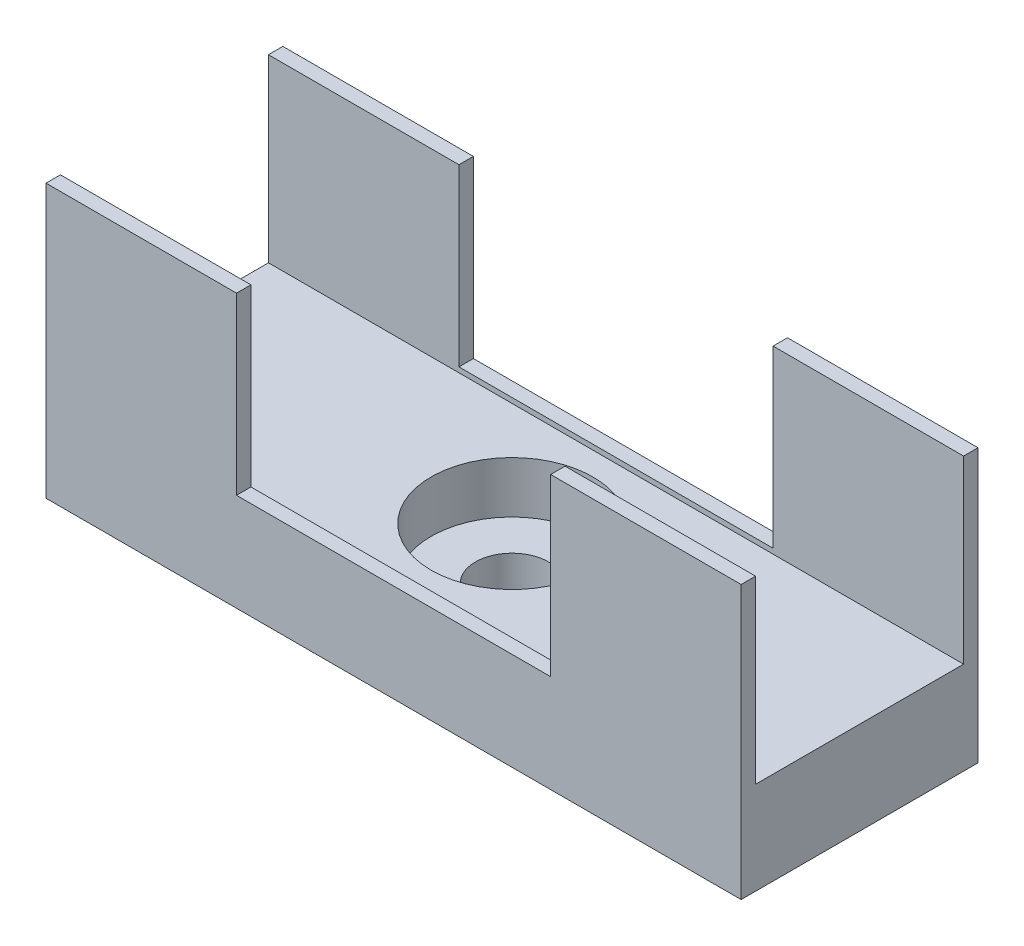
ISO-10303-21;
HEADER;
FILE_DESCRIPTION(('STEP AP214'),'2;1');
FILE_NAME('part.step','',(''),(''),'','','');
FILE_SCHEMA(('AUTOMOTIVE_DESIGN { 1 0 10303 214 1 1 1 1 }'));
ENDSEC;
DATA;
#1=APPLICATION_CONTEXT('core data for automotive mechanical design processes');
#2=APPLICATION_PROTOCOL_DEFINITION('international standard','automotive_design',2000,#1);
#3=PRODUCT_CONTEXT('',#1,'mechanical');
#4=PRODUCT('Part','Part','',(#3));
#5=PRODUCT_RELATED_PRODUCT_CATEGORY('part','',(#4));
#6=PRODUCT_DEFINITION_FORMATION('','',#4);
#7=PRODUCT_DEFINITION_CONTEXT('part definition',#1,'design');
#8=PRODUCT_DEFINITION('design','',#6,#7);
#9=PRODUCT_DEFINITION_SHAPE('','',#8);
#10=(LENGTH_UNIT() NAMED_UNIT(*) SI_UNIT(.MILLI.,.METRE.));
#11=(NAMED_UNIT(*) PLANE_ANGLE_UNIT() SI_UNIT($,.RADIAN.));
#12=(NAMED_UNIT(*) SI_UNIT($,.STERADIAN.) SOLID_ANGLE_UNIT());
#13=UNCERTAINTY_MEASURE_WITH_UNIT(LENGTH_MEASURE(1.E-05),#10,'distance_accuracy_value','');
#14=(GEOMETRIC_REPRESENTATION_CONTEXT(3) GLOBAL_UNCERTAINTY_ASSIGNED_CONTEXT((#13)) GLOBAL_UNIT_ASSIGNED_CONTEXT((#10,
#11,#12)) REPRESENTATION_CONTEXT('',''));
#15=CARTESIAN_POINT('',(0.,0.,0.));
#16=DIRECTION('',(0.,0.,1.));
#17=DIRECTION('',(1.,0.,0.));
#18=AXIS2_PLACEMENT_3D('',#15,#16,#17);
#19=CARTESIAN_POINT('',(0.,13.462,0.));
#20=DIRECTION('',(0.,1.,0.));
#21=DIRECTION('',(0.,0.,1.));
#22=AXIS2_PLACEMENT_3D('',#19,#20,#21);
#23=PLANE('',#22);
#24=DIRECTION('',(1.,0.,0.));
#25=VECTOR('',#24,1.);
#26=CARTESIAN_POINT('',(-17.145,13.462,5.1308));
#27=LINE('',#26,#25);
#28=CARTESIAN_POINT('',(-17.145,13.462,5.1308));
#29=VERTEX_POINT('',#28);
#30=CARTESIAN_POINT('',(-7.747,13.462,5.1308));
#31=VERTEX_POINT('',#30);
#32=EDGE_CURVE('E164',#29,#31,#27,.T.);
#33=ORIENTED_EDGE('',*,*,#32,.F.);
#34=DIRECTION('',(0.,0.,1.));
#35=VECTOR('',#34,1.);
#36=CARTESIAN_POINT('',(-17.145,13.462,-5.842));
#37=LINE('',#36,#35);
#38=CARTESIAN_POINT('',(-17.145,13.462,5.842));
#39=VERTEX_POINT('',#38);
#40=EDGE_CURVE('E220',#29,#39,#37,.T.);
#41=ORIENTED_EDGE('',*,*,#40,.T.);
#42=DIRECTION('',(1.,0.,0.));
#43=VECTOR('',#42,1.);
#44=CARTESIAN_POINT('',(-17.145,13.462,5.842));
#45=LINE('',#44,#43);
#46=CARTESIAN_POINT('',(-7.747,13.462,5.842));
#47=VERTEX_POINT('',#46);
#48=EDGE_CURVE('E225',#39,#47,#45,.T.);
#49=ORIENTED_EDGE('',*,*,#48,.T.);
#50=DIRECTION('',(0.,0.,1.));
#51=VECTOR('',#50,1.);
#52=CARTESIAN_POINT('',(-7.747,13.462,0.));
#53=LINE('',#52,#51);
#54=EDGE_CURVE('E251',#31,#47,#53,.T.);
#55=ORIENTED_EDGE('',*,*,#54,.F.);
#56=EDGE_LOOP('',(#33,#41,#49,#55));
#57=FACE_BOUND('',#56,.T.);
#58=ADVANCED_FACE('F33',(#57),#23,.T.);
#59=CARTESIAN_POINT('',(7.747,13.462,5.1308));
#60=VERTEX_POINT('',#59);
#61=CARTESIAN_POINT('',(17.145,13.462,5.1308));
#62=VERTEX_POINT('',#61);
#63=EDGE_CURVE('E289',#60,#62,#27,.T.);
#64=ORIENTED_EDGE('',*,*,#63,.F.);
#65=DIRECTION('',(0.,0.,-1.));
#66=VECTOR('',#65,1.);
#67=CARTESIAN_POINT('',(7.747,13.462,0.));
#68=LINE('',#67,#66);
#69=CARTESIAN_POINT('',(7.747,13.462,5.842));
#70=VERTEX_POINT('',#69);
#71=EDGE_CURVE('E249',#70,#60,#68,.T.);
#72=ORIENTED_EDGE('',*,*,#71,.F.);
#73=CARTESIAN_POINT('',(17.145,13.462,5.842));
#74=VERTEX_POINT('',#73);
#75=EDGE_CURVE('E224',#70,#74,#45,.T.);
#76=ORIENTED_EDGE('',*,*,#75,.T.);
#77=DIRECTION('',(0.,0.,-1.));
#78=VECTOR('',#77,1.);
#79=CARTESIAN_POINT('',(17.145,13.462,-5.842));
#80=LINE('',#79,#78);
#81=EDGE_CURVE('E213',#74,#62,#80,.T.);
#82=ORIENTED_EDGE('',*,*,#81,.T.);
#83=EDGE_LOOP('',(#64,#72,#76,#82));
#84=FACE_BOUND('',#83,.T.);
#85=ADVANCED_FACE('F316',(#84),#23,.T.);
#86=CARTESIAN_POINT('',(-7.747,4.826,-17.78));
#87=DIRECTION('',(0.,-1.,0.));
#88=DIRECTION('',(1.,0.,0.));
#89=AXIS2_PLACEMENT_3D('',#86,#87,#88);
#90=PLANE('',#89);
#91=DIRECTION('',(0.,0.,1.));
#92=VECTOR('',#91,1.);
#93=CARTESIAN_POINT('',(7.747,4.826,-17.78));
#94=LINE('',#93,#92);
#95=CARTESIAN_POINT('',(7.747,4.826,5.1308));
#96=VERTEX_POINT('',#95);
#97=CARTESIAN_POINT('',(7.747,4.826,5.842));
#98=VERTEX_POINT('',#97);
#99=EDGE_CURVE('E200',#96,#98,#94,.T.);
#100=ORIENTED_EDGE('',*,*,#99,.F.);
#101=DIRECTION('',(-1.,0.,0.));
#102=VECTOR('',#101,1.);
#103=CARTESIAN_POINT('',(-7.747,4.826,5.1308));
#104=LINE('',#103,#102);
#105=CARTESIAN_POINT('',(-7.747,4.826,5.1308));
#106=VERTEX_POINT('',#105);
#107=EDGE_CURVE('E182',#96,#106,#104,.T.);
#108=ORIENTED_EDGE('',*,*,#107,.T.);
#109=DIRECTION('',(0.,0.,1.));
#110=VECTOR('',#109,1.);
#111=CARTESIAN_POINT('',(-7.747,4.826,-17.78));
#112=LINE('',#111,#110);
#113=CARTESIAN_POINT('',(-7.747,4.826,5.842));
#114=VERTEX_POINT('',#113);
#115=EDGE_CURVE('E195',#106,#114,#112,.T.);
#116=ORIENTED_EDGE('',*,*,#115,.T.);
#117=DIRECTION('',(1.,0.,0.));
#118=VECTOR('',#117,1.);
#119=CARTESIAN_POINT('',(-7.747,4.826,5.842));
#120=LINE('',#119,#118);
#121=EDGE_CURVE('E191',#114,#98,#120,.T.);
#122=ORIENTED_EDGE('',*,*,#121,.T.);
#123=EDGE_LOOP('',(#100,#108,#116,#122));
#124=FACE_BOUND('',#123,.T.);
#125=ADVANCED_FACE('F312',(#124),#90,.F.);
#126=CARTESIAN_POINT('',(-7.747,13.462,-17.78));
#127=DIRECTION('',(-1.,0.,0.));
#128=DIRECTION('',(0.,-1.,0.));
#129=AXIS2_PLACEMENT_3D('',#126,#127,#128);
#130=PLANE('',#129);
#131=ORIENTED_EDGE('',*,*,#115,.F.);
#132=DIRECTION('',(0.,1.,0.));
#133=VECTOR('',#132,1.);
#134=CARTESIAN_POINT('',(-7.747,13.462,5.1308));
#135=LINE('',#134,#133);
#136=EDGE_CURVE('E185',#106,#31,#135,.T.);
#137=ORIENTED_EDGE('',*,*,#136,.T.);
#138=ORIENTED_EDGE('',*,*,#54,.T.);
#139=DIRECTION('',(0.,-1.,0.));
#140=VECTOR('',#139,1.);
#141=CARTESIAN_POINT('',(-7.747,13.462,5.842));
#142=LINE('',#141,#140);
#143=EDGE_CURVE('E188',#47,#114,#142,.T.);
#144=ORIENTED_EDGE('',*,*,#143,.T.);
#145=EDGE_LOOP('',(#131,#137,#138,#144));
#146=FACE_BOUND('',#145,.T.);
#147=ADVANCED_FACE('F309',(#146),#130,.F.);
#148=CARTESIAN_POINT('',(7.747,13.462,-17.78));
#149=DIRECTION('',(1.,0.,0.));
#150=DIRECTION('',(0.,1.,0.));
#151=AXIS2_PLACEMENT_3D('',#148,#149,#150);
#152=PLANE('',#151);
#153=ORIENTED_EDGE('',*,*,#71,.T.);
#154=DIRECTION('',(0.,-1.,0.));
#155=VECTOR('',#154,1.);
#156=CARTESIAN_POINT('',(7.747,13.462,5.1308));
#157=LINE('',#156,#155);
#158=EDGE_CURVE('E11',#60,#96,#157,.T.);
#159=ORIENTED_EDGE('',*,*,#158,.T.);
#160=ORIENTED_EDGE('',*,*,#99,.T.);
#161=DIRECTION('',(0.,1.,0.));
#162=VECTOR('',#161,1.);
#163=CARTESIAN_POINT('',(7.747,13.462,5.842));
#164=LINE('',#163,#162);
#165=EDGE_CURVE('E56',#98,#70,#164,.T.);
#166=ORIENTED_EDGE('',*,*,#165,.T.);
#167=EDGE_LOOP('',(#153,#159,#160,#166));
#168=FACE_BOUND('',#167,.T.);
#169=ADVANCED_FACE('F313',(#168),#152,.F.);
#170=DIRECTION('',(-1.,0.,0.));
#171=VECTOR('',#170,1.);
#172=CARTESIAN_POINT('',(-17.145,13.462,-5.1308));
#173=LINE('',#172,#171);
#174=CARTESIAN_POINT('',(-7.747,13.462,-5.1308));
#175=VERTEX_POINT('',#174);
#176=CARTESIAN_POINT('',(-17.145,13.462,-5.1308));
#177=VERTEX_POINT('',#176);
#178=EDGE_CURVE('E281',#175,#177,#173,.T.);
#179=ORIENTED_EDGE('',*,*,#178,.F.);
#180=CARTESIAN_POINT('',(-7.747,13.462,-5.842));
#181=VERTEX_POINT('',#180);
#182=EDGE_CURVE('E252',#181,#175,#53,.T.);
#183=ORIENTED_EDGE('',*,*,#182,.F.);
#184=DIRECTION('',(-1.,0.,0.));
#185=VECTOR('',#184,1.);
#186=CARTESIAN_POINT('',(-17.145,13.462,-5.842));
#187=LINE('',#186,#185);
#188=CARTESIAN_POINT('',(-17.145,13.462,-5.842));
#189=VERTEX_POINT('',#188);
#190=EDGE_CURVE('E216',#181,#189,#187,.T.);
#191=ORIENTED_EDGE('',*,*,#190,.T.);
#192=EDGE_CURVE('E221',#189,#177,#37,.T.);
#193=ORIENTED_EDGE('',*,*,#192,.T.);
#194=EDGE_LOOP('',(#179,#183,#191,#193));
#195=FACE_BOUND('',#194,.T.);
#196=ADVANCED_FACE('F279',(#195),#23,.T.);
#197=CARTESIAN_POINT('',(17.145,13.462,-5.842));
#198=DIRECTION('',(-1.,0.,0.));
#199=DIRECTION('',(0.,0.,1.));
#200=AXIS2_PLACEMENT_3D('',#197,#198,#199);
#201=PLANE('',#200);
#202=DIRECTION('',(0.,0.,-1.));
#203=VECTOR('',#202,1.);
#204=CARTESIAN_POINT('',(17.145,4.572,-5.1308));
#205=LINE('',#204,#203);
#206=CARTESIAN_POINT('',(17.145,4.572,5.1308));
#207=VERTEX_POINT('',#206);
#208=CARTESIAN_POINT('',(17.145,4.572,-5.1308));
#209=VERTEX_POINT('',#208);
#210=EDGE_CURVE('E155',#207,#209,#205,.T.);
#211=ORIENTED_EDGE('',*,*,#210,.F.);
#212=DIRECTION('',(0.,1.,0.));
#213=VECTOR('',#212,1.);
#214=CARTESIAN_POINT('',(17.145,4.572,5.1308));
#215=LINE('',#214,#213);
#216=EDGE_CURVE('E179',#207,#62,#215,.T.);
#217=ORIENTED_EDGE('',*,*,#216,.T.);
#218=ORIENTED_EDGE('',*,*,#81,.F.);
#219=DIRECTION('',(0.,-1.,0.));
#220=VECTOR('',#219,1.);
#221=CARTESIAN_POINT('',(17.145,13.462,5.842));
#222=LINE('',#221,#220);
#223=CARTESIAN_POINT('',(17.145,0.,5.842));
#224=VERTEX_POINT('',#223);
#225=EDGE_CURVE('E228',#74,#224,#222,.T.);
#226=ORIENTED_EDGE('',*,*,#225,.T.);
#227=DIRECTION('',(0.,0.,-1.));
#228=VECTOR('',#227,1.);
#229=CARTESIAN_POINT('',(17.145,0.,-5.842));
#230=LINE('',#229,#228);
#231=CARTESIAN_POINT('',(17.145,0.,-5.842));
#232=VERTEX_POINT('',#231);
#233=EDGE_CURVE('E212',#224,#232,#230,.T.);
#234=ORIENTED_EDGE('',*,*,#233,.T.);
#235=DIRECTION('',(0.,-1.,0.));
#236=VECTOR('',#235,1.);
#237=CARTESIAN_POINT('',(17.145,13.462,-5.842));
#238=LINE('',#237,#236);
#239=CARTESIAN_POINT('',(17.145,13.462,-5.842));
#240=VERTEX_POINT('',#239);
#241=EDGE_CURVE('E245',#240,#232,#238,.T.);
#242=ORIENTED_EDGE('',*,*,#241,.F.);
#243=CARTESIAN_POINT('',(17.145,13.462,-5.1308));
#244=VERTEX_POINT('',#243);
#245=EDGE_CURVE('E168',#244,#240,#80,.T.);
#246=ORIENTED_EDGE('',*,*,#245,.F.);
#247=DIRECTION('',(0.,1.,0.));
#248=VECTOR('',#247,1.);
#249=CARTESIAN_POINT('',(17.145,4.572,-5.1308));
#250=LINE('',#249,#248);
#251=EDGE_CURVE('E149',#209,#244,#250,.T.);
#252=ORIENTED_EDGE('',*,*,#251,.F.);
#253=EDGE_LOOP('',(#211,#217,#218,#226,#234,#242,#246,#252));
#254=FACE_BOUND('',#253,.T.);
#255=ADVANCED_FACE('F35',(#254),#201,.F.);
#256=CARTESIAN_POINT('',(-17.145,13.462,-5.842));
#257=DIRECTION('',(0.,0.,1.));
#258=DIRECTION('',(1.,0.,0.));
#259=AXIS2_PLACEMENT_3D('',#256,#257,#258);
#260=PLANE('',#259);
#261=ORIENTED_EDGE('',*,*,#190,.F.);
#262=DIRECTION('',(0.,-1.,0.));
#263=VECTOR('',#262,1.);
#264=CARTESIAN_POINT('',(-7.747,13.462,-5.842));
#265=LINE('',#264,#263);
#266=CARTESIAN_POINT('',(-7.747,4.826,-5.842));
#267=VERTEX_POINT('',#266);
#268=EDGE_CURVE('E206',#181,#267,#265,.T.);
#269=ORIENTED_EDGE('',*,*,#268,.T.);
#270=DIRECTION('',(1.,0.,0.));
#271=VECTOR('',#270,1.);
#272=CARTESIAN_POINT('',(-17.145,4.826,-5.842));
#273=LINE('',#272,#271);
#274=CARTESIAN_POINT('',(7.747,4.826,-5.842));
#275=VERTEX_POINT('',#274);
#276=EDGE_CURVE('E209',#267,#275,#273,.T.);
#277=ORIENTED_EDGE('',*,*,#276,.T.);
#278=DIRECTION('',(0.,1.,0.));
#279=VECTOR('',#278,1.);
#280=CARTESIAN_POINT('',(7.747,13.462,-5.842));
#281=LINE('',#280,#279);
#282=CARTESIAN_POINT('',(7.747,13.462,-5.842));
#283=VERTEX_POINT('',#282);
#284=EDGE_CURVE('E199',#275,#283,#281,.T.);
#285=ORIENTED_EDGE('',*,*,#284,.T.);
#286=EDGE_CURVE('E217',#240,#283,#187,.T.);
#287=ORIENTED_EDGE('',*,*,#286,.F.);
#288=ORIENTED_EDGE('',*,*,#241,.T.);
#289=DIRECTION('',(-1.,0.,0.));
#290=VECTOR('',#289,1.);
#291=CARTESIAN_POINT('',(-17.145,0.,-5.842));
#292=LINE('',#291,#290);
#293=CARTESIAN_POINT('',(-17.145,0.,-5.842));
#294=VERTEX_POINT('',#293);
#295=EDGE_CURVE('E231',#232,#294,#292,.T.);
#296=ORIENTED_EDGE('',*,*,#295,.T.);
#297=DIRECTION('',(0.,-1.,0.));
#298=VECTOR('',#297,1.);
#299=CARTESIAN_POINT('',(-17.145,13.462,-5.842));
#300=LINE('',#299,#298);
#301=EDGE_CURVE('E242',#189,#294,#300,.T.);
#302=ORIENTED_EDGE('',*,*,#301,.F.);
#303=EDGE_LOOP('',(#261,#269,#277,#285,#287,#288,#296,#302));
#304=FACE_BOUND('',#303,.T.);
#305=ADVANCED_FACE('F263',(#304),#260,.F.);
#306=CARTESIAN_POINT('',(-17.145,13.462,-5.842));
#307=DIRECTION('',(1.,0.,0.));
#308=DIRECTION('',(0.,0.,-1.));
#309=AXIS2_PLACEMENT_3D('',#306,#307,#308);
#310=PLANE('',#309);
#311=ORIENTED_EDGE('',*,*,#40,.F.);
#312=DIRECTION('',(0.,1.,0.));
#313=VECTOR('',#312,1.);
#314=CARTESIAN_POINT('',(-17.145,4.572,5.1308));
#315=LINE('',#314,#313);
#316=CARTESIAN_POINT('',(-17.145,4.572,5.1308));
#317=VERTEX_POINT('',#316);
#318=EDGE_CURVE('E170',#317,#29,#315,.T.);
#319=ORIENTED_EDGE('',*,*,#318,.F.);
#320=DIRECTION('',(0.,0.,1.));
#321=VECTOR('',#320,1.);
#322=CARTESIAN_POINT('',(-17.145,4.572,-5.1308));
#323=LINE('',#322,#321);
#324=CARTESIAN_POINT('',(-17.145,4.572,-5.1308));
#325=VERTEX_POINT('',#324);
#326=EDGE_CURVE('E154',#325,#317,#323,.T.);
#327=ORIENTED_EDGE('',*,*,#326,.F.);
#328=DIRECTION('',(0.,1.,0.));
#329=VECTOR('',#328,1.);
#330=CARTESIAN_POINT('',(-17.145,4.572,-5.1308));
#331=LINE('',#330,#329);
#332=EDGE_CURVE('E151',#325,#177,#331,.T.);
#333=ORIENTED_EDGE('',*,*,#332,.T.);
#334=ORIENTED_EDGE('',*,*,#192,.F.);
#335=ORIENTED_EDGE('',*,*,#301,.T.);
#336=DIRECTION('',(0.,0.,1.));
#337=VECTOR('',#336,1.);
#338=CARTESIAN_POINT('',(-17.145,0.,-5.842));
#339=LINE('',#338,#337);
#340=CARTESIAN_POINT('',(-17.145,0.,5.842));
#341=VERTEX_POINT('',#340);
#342=EDGE_CURVE('E233',#294,#341,#339,.T.);
#343=ORIENTED_EDGE('',*,*,#342,.T.);
#344=DIRECTION('',(0.,-1.,0.));
#345=VECTOR('',#344,1.);
#346=CARTESIAN_POINT('',(-17.145,13.462,5.842));
#347=LINE('',#346,#345);
#348=EDGE_CURVE('E239',#39,#341,#347,.T.);
#349=ORIENTED_EDGE('',*,*,#348,.F.);
#350=EDGE_LOOP('',(#311,#319,#327,#333,#334,#335,#343,#349));
#351=FACE_BOUND('',#350,.T.);
#352=ADVANCED_FACE('F275',(#351),#310,.F.);
#353=CARTESIAN_POINT('',(-17.145,13.462,5.842));
#354=DIRECTION('',(0.,0.,-1.));
#355=DIRECTION('',(-1.,0.,0.));
#356=AXIS2_PLACEMENT_3D('',#353,#354,#355);
#357=PLANE('',#356);
#358=ORIENTED_EDGE('',*,*,#121,.F.);
#359=ORIENTED_EDGE('',*,*,#143,.F.);
#360=ORIENTED_EDGE('',*,*,#48,.F.);
#361=ORIENTED_EDGE('',*,*,#348,.T.);
#362=DIRECTION('',(1.,0.,0.));
#363=VECTOR('',#362,1.);
#364=CARTESIAN_POINT('',(-17.145,0.,5.842));
#365=LINE('',#364,#363);
#366=EDGE_CURVE('E235',#341,#224,#365,.T.);
#367=ORIENTED_EDGE('',*,*,#366,.T.);
#368=ORIENTED_EDGE('',*,*,#225,.F.);
#369=ORIENTED_EDGE('',*,*,#75,.F.);
#370=ORIENTED_EDGE('',*,*,#165,.F.);
#371=EDGE_LOOP('',(#358,#359,#360,#361,#367,#368,#369,#370));
#372=FACE_BOUND('',#371,.T.);
#373=ADVANCED_FACE('F306',(#372),#357,.F.);
#374=CARTESIAN_POINT('',(7.747,13.462,-5.1308));
#375=VERTEX_POINT('',#374);
#376=EDGE_CURVE('E48',#244,#375,#173,.T.);
#377=ORIENTED_EDGE('',*,*,#376,.F.);
#378=ORIENTED_EDGE('',*,*,#245,.T.);
#379=ORIENTED_EDGE('',*,*,#286,.T.);
#380=EDGE_CURVE('E248',#375,#283,#68,.T.);
#381=ORIENTED_EDGE('',*,*,#380,.F.);
#382=EDGE_LOOP('',(#377,#378,#379,#381));
#383=FACE_BOUND('',#382,.T.);
#384=ADVANCED_FACE('F259',(#383),#23,.T.);
#385=CARTESIAN_POINT('',(0.,0.,0.));
#386=DIRECTION('',(0.,1.,0.));
#387=DIRECTION('',(0.,0.,1.));
#388=AXIS2_PLACEMENT_3D('',#385,#386,#387);
#389=PLANE('',#388);
#390=CARTESIAN_POINT('',(0.,0.,0.));
#391=DIRECTION('',(0.,1.,0.));
#392=DIRECTION('',(0.,0.,1.));
#393=AXIS2_PLACEMENT_3D('',#390,#391,#392);
#394=CIRCLE('',#393,1.8034);
#395=CARTESIAN_POINT('',(0.,0.,1.8034));
#396=VERTEX_POINT('',#395);
#397=EDGE_CURVE('E455',#396,#396,#394,.T.);
#398=ORIENTED_EDGE('',*,*,#397,.T.);
#399=EDGE_LOOP('',(#398));
#400=FACE_BOUND('',#399,.T.);
#401=ORIENTED_EDGE('',*,*,#233,.F.);
#402=ORIENTED_EDGE('',*,*,#366,.F.);
#403=ORIENTED_EDGE('',*,*,#342,.F.);
#404=ORIENTED_EDGE('',*,*,#295,.F.);
#405=EDGE_LOOP('',(#401,#402,#403,#404));
#406=FACE_BOUND('',#405,.T.);
#407=ADVANCED_FACE('F269',(#400,#406),#389,.F.);
#408=CARTESIAN_POINT('',(-7.747,4.826,-5.1308));
#409=VERTEX_POINT('',#408);
#410=EDGE_CURVE('E201',#267,#409,#112,.T.);
#411=ORIENTED_EDGE('',*,*,#410,.T.);
#412=DIRECTION('',(1.,0.,0.));
#413=VECTOR('',#412,1.);
#414=CARTESIAN_POINT('',(-7.747,4.826,-5.1308));
#415=LINE('',#414,#413);
#416=CARTESIAN_POINT('',(7.747,4.826,-5.1308));
#417=VERTEX_POINT('',#416);
#418=EDGE_CURVE('E175',#409,#417,#415,.T.);
#419=ORIENTED_EDGE('',*,*,#418,.T.);
#420=EDGE_CURVE('E196',#275,#417,#94,.T.);
#421=ORIENTED_EDGE('',*,*,#420,.F.);
#422=ORIENTED_EDGE('',*,*,#276,.F.);
#423=EDGE_LOOP('',(#411,#419,#421,#422));
#424=FACE_BOUND('',#423,.T.);
#425=ADVANCED_FACE('F286',(#424),#90,.F.);
#426=ORIENTED_EDGE('',*,*,#182,.T.);
#427=DIRECTION('',(0.,-1.,0.));
#428=VECTOR('',#427,1.);
#429=CARTESIAN_POINT('',(-7.747,13.462,-5.1308));
#430=LINE('',#429,#428);
#431=EDGE_CURVE('E178',#175,#409,#430,.T.);
#432=ORIENTED_EDGE('',*,*,#431,.T.);
#433=ORIENTED_EDGE('',*,*,#410,.F.);
#434=ORIENTED_EDGE('',*,*,#268,.F.);
#435=EDGE_LOOP('',(#426,#432,#433,#434));
#436=FACE_BOUND('',#435,.T.);
#437=ADVANCED_FACE('F284',(#436),#130,.F.);
#438=ORIENTED_EDGE('',*,*,#420,.T.);
#439=DIRECTION('',(0.,1.,0.));
#440=VECTOR('',#439,1.);
#441=CARTESIAN_POINT('',(7.747,13.462,-5.1308));
#442=LINE('',#441,#440);
#443=EDGE_CURVE('E41',#417,#375,#442,.T.);
#444=ORIENTED_EDGE('',*,*,#443,.T.);
#445=ORIENTED_EDGE('',*,*,#380,.T.);
#446=ORIENTED_EDGE('',*,*,#284,.F.);
#447=EDGE_LOOP('',(#438,#444,#445,#446));
#448=FACE_BOUND('',#447,.T.);
#449=ADVANCED_FACE('F256',(#448),#152,.F.);
#450=CARTESIAN_POINT('',(-17.145,4.572,5.1308));
#451=DIRECTION('',(0.,0.,1.));
#452=DIRECTION('',(1.,0.,0.));
#453=AXIS2_PLACEMENT_3D('',#450,#451,#452);
#454=PLANE('',#453);
#455=ORIENTED_EDGE('',*,*,#107,.F.);
#456=ORIENTED_EDGE('',*,*,#158,.F.);
#457=ORIENTED_EDGE('',*,*,#63,.T.);
#458=ORIENTED_EDGE('',*,*,#216,.F.);
#459=DIRECTION('',(1.,0.,0.));
#460=VECTOR('',#459,1.);
#461=CARTESIAN_POINT('',(-17.145,4.572,5.1308));
#462=LINE('',#461,#460);
#463=EDGE_CURVE('E161',#317,#207,#462,.T.);
#464=ORIENTED_EDGE('',*,*,#463,.F.);
#465=ORIENTED_EDGE('',*,*,#318,.T.);
#466=ORIENTED_EDGE('',*,*,#32,.T.);
#467=ORIENTED_EDGE('',*,*,#136,.F.);
#468=EDGE_LOOP('',(#455,#456,#457,#458,#464,#465,#466,#467));
#469=FACE_BOUND('',#468,.T.);
#470=ADVANCED_FACE('F299',(#469),#454,.F.);
#471=CARTESIAN_POINT('',(-17.145,4.572,-5.1308));
#472=DIRECTION('',(0.,0.,-1.));
#473=DIRECTION('',(-1.,0.,0.));
#474=AXIS2_PLACEMENT_3D('',#471,#472,#473);
#475=PLANE('',#474);
#476=ORIENTED_EDGE('',*,*,#178,.T.);
#477=ORIENTED_EDGE('',*,*,#332,.F.);
#478=DIRECTION('',(-1.,0.,0.));
#479=VECTOR('',#478,1.);
#480=CARTESIAN_POINT('',(-17.145,4.572,-5.1308));
#481=LINE('',#480,#479);
#482=EDGE_CURVE('E145',#209,#325,#481,.T.);
#483=ORIENTED_EDGE('',*,*,#482,.F.);
#484=ORIENTED_EDGE('',*,*,#251,.T.);
#485=ORIENTED_EDGE('',*,*,#376,.T.);
#486=ORIENTED_EDGE('',*,*,#443,.F.);
#487=ORIENTED_EDGE('',*,*,#418,.F.);
#488=ORIENTED_EDGE('',*,*,#431,.F.);
#489=EDGE_LOOP('',(#476,#477,#483,#484,#485,#486,#487,#488));
#490=FACE_BOUND('',#489,.T.);
#491=ADVANCED_FACE('F147',(#490),#475,.F.);
#492=CARTESIAN_POINT('',(0.,4.572,0.));
#493=DIRECTION('',(0.,1.,0.));
#494=DIRECTION('',(0.,0.,1.));
#495=AXIS2_PLACEMENT_3D('',#492,#493,#494);
#496=PLANE('',#495);
#497=CARTESIAN_POINT('',(0.,4.572,0.));
#498=DIRECTION('',(0.,1.,0.));
#499=DIRECTION('',(0.,0.,1.));
#500=AXIS2_PLACEMENT_3D('',#497,#498,#499);
#501=CIRCLE('',#500,3.9878);
#502=CARTESIAN_POINT('',(0.,4.572,3.9878));
#503=VERTEX_POINT('',#502);
#504=EDGE_CURVE('E291',#503,#503,#501,.T.);
#505=ORIENTED_EDGE('',*,*,#504,.F.);
#506=EDGE_LOOP('',(#505));
#507=FACE_BOUND('',#506,.T.);
#508=ORIENTED_EDGE('',*,*,#210,.T.);
#509=ORIENTED_EDGE('',*,*,#482,.T.);
#510=ORIENTED_EDGE('',*,*,#326,.T.);
#511=ORIENTED_EDGE('',*,*,#463,.T.);
#512=EDGE_LOOP('',(#508,#509,#510,#511));
#513=FACE_BOUND('',#512,.T.);
#514=ADVANCED_FACE('F159',(#507,#513),#496,.T.);
#515=CARTESIAN_POINT('',(0.,2.032,0.));
#516=DIRECTION('',(0.,1.,0.));
#517=DIRECTION('',(0.,0.,1.));
#518=AXIS2_PLACEMENT_3D('',#515,#516,#517);
#519=CYLINDRICAL_SURFACE('',#518,3.9878);
#520=CARTESIAN_POINT('',(0.,2.032,0.));
#521=DIRECTION('',(0.,1.,0.));
#522=DIRECTION('',(0.,0.,1.));
#523=AXIS2_PLACEMENT_3D('',#520,#521,#522);
#524=CIRCLE('',#523,3.9878);
#525=CARTESIAN_POINT('',(0.,2.032,3.9878));
#526=VERTEX_POINT('',#525);
#527=EDGE_CURVE('E287',#526,#526,#524,.T.);
#528=ORIENTED_EDGE('',*,*,#527,.F.);
#529=EDGE_LOOP('',(#528));
#530=FACE_BOUND('',#529,.T.);
#531=ORIENTED_EDGE('',*,*,#504,.T.);
#532=EDGE_LOOP('',(#531));
#533=FACE_BOUND('',#532,.T.);
#534=ADVANCED_FACE('F410',(#530,#533),#519,.F.);
#535=CARTESIAN_POINT('',(0.,2.032,0.));
#536=DIRECTION('',(0.,1.,0.));
#537=DIRECTION('',(0.,0.,1.));
#538=AXIS2_PLACEMENT_3D('',#535,#536,#537);
#539=PLANE('',#538);
#540=CARTESIAN_POINT('',(0.,2.032,0.));
#541=DIRECTION('',(0.,1.,0.));
#542=DIRECTION('',(0.,0.,1.));
#543=AXIS2_PLACEMENT_3D('',#540,#541,#542);
#544=CIRCLE('',#543,1.8034);
#545=CARTESIAN_POINT('',(0.,2.032,1.8034));
#546=VERTEX_POINT('',#545);
#547=EDGE_CURVE('E452',#546,#546,#544,.T.);
#548=ORIENTED_EDGE('',*,*,#547,.F.);
#549=EDGE_LOOP('',(#548));
#550=FACE_BOUND('',#549,.T.);
#551=ORIENTED_EDGE('',*,*,#527,.T.);
#552=EDGE_LOOP('',(#551));
#553=FACE_BOUND('',#552,.T.);
#554=ADVANCED_FACE('F420',(#550,#553),#539,.T.);
#555=CARTESIAN_POINT('',(0.,-5.588,0.));
#556=DIRECTION('',(0.,1.,0.));
#557=DIRECTION('',(0.,0.,1.));
#558=AXIS2_PLACEMENT_3D('',#555,#556,#557);
#559=CYLINDRICAL_SURFACE('',#558,1.8034);
#560=ORIENTED_EDGE('',*,*,#547,.T.);
#561=EDGE_LOOP('',(#560));
#562=FACE_BOUND('',#561,.T.);
#563=ORIENTED_EDGE('',*,*,#397,.F.);
#564=EDGE_LOOP('',(#563));
#565=FACE_BOUND('',#564,.T.);
#566=ADVANCED_FACE('F435',(#562,#565),#559,.F.);
#567=CLOSED_SHELL('',(#58,#85,#125,#147,#169,#196,#255,#305,#352,#373,#384,#407,#425,#437,#449,
#470,#491,#514,#534,#554,#566));
#568=MANIFOLD_SOLID_BREP('B2',#567);
#569=ADVANCED_BREP_SHAPE_REPRESENTATION('',(#18,#568),#14);
#570=SHAPE_DEFINITION_REPRESENTATION(#9,#569);
ENDSEC;
END-ISO-10303-21;
